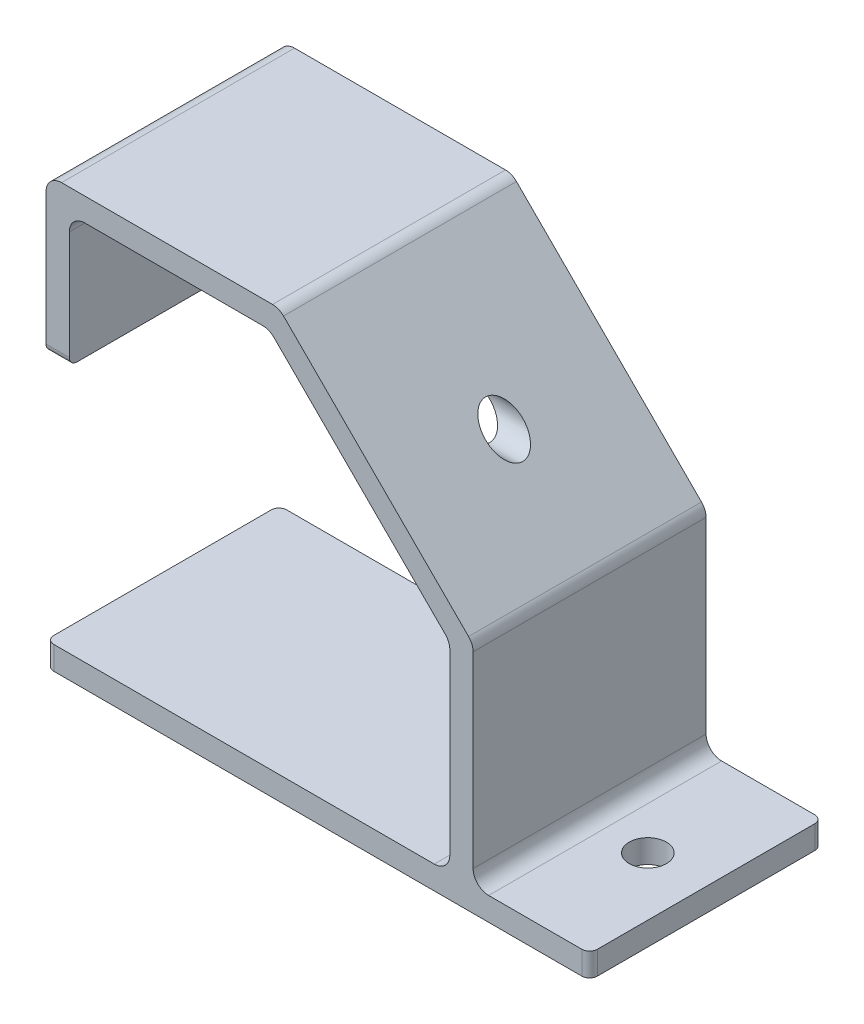
ISO-10303-21;
HEADER;
FILE_DESCRIPTION(('STEP AP214'),'2;1');
FILE_NAME('part.step','',(''),(''),'','','');
FILE_SCHEMA(('AUTOMOTIVE_DESIGN { 1 0 10303 214 1 1 1 1 }'));
ENDSEC;
DATA;
#1=APPLICATION_CONTEXT('core data for automotive mechanical design processes');
#2=APPLICATION_PROTOCOL_DEFINITION('international standard','automotive_design',2000,#1);
#3=PRODUCT_CONTEXT('',#1,'mechanical');
#4=PRODUCT('Part','Part','',(#3));
#5=PRODUCT_RELATED_PRODUCT_CATEGORY('part','',(#4));
#6=PRODUCT_DEFINITION_FORMATION('','',#4);
#7=PRODUCT_DEFINITION_CONTEXT('part definition',#1,'design');
#8=PRODUCT_DEFINITION('design','',#6,#7);
#9=PRODUCT_DEFINITION_SHAPE('','',#8);
#10=(LENGTH_UNIT() NAMED_UNIT(*) SI_UNIT(.MILLI.,.METRE.));
#11=(NAMED_UNIT(*) PLANE_ANGLE_UNIT() SI_UNIT($,.RADIAN.));
#12=(NAMED_UNIT(*) SI_UNIT($,.STERADIAN.) SOLID_ANGLE_UNIT());
#13=UNCERTAINTY_MEASURE_WITH_UNIT(LENGTH_MEASURE(1.E-05),#10,'distance_accuracy_value','');
#14=(GEOMETRIC_REPRESENTATION_CONTEXT(3) GLOBAL_UNCERTAINTY_ASSIGNED_CONTEXT((#13)) GLOBAL_UNIT_ASSIGNED_CONTEXT((#10,
#11,#12)) REPRESENTATION_CONTEXT('',''));
#15=CARTESIAN_POINT('',(0.,0.,0.));
#16=DIRECTION('',(0.,0.,1.));
#17=DIRECTION('',(1.,0.,0.));
#18=AXIS2_PLACEMENT_3D('',#15,#16,#17);
#19=CARTESIAN_POINT('',(55.,0.,30.));
#20=DIRECTION('',(0.,-1.,0.));
#21=DIRECTION('',(1.,0.,0.));
#22=AXIS2_PLACEMENT_3D('',#19,#20,#21);
#23=PLANE('',#22);
#24=CARTESIAN_POINT('',(62.5,0.,15.));
#25=DIRECTION('',(0.,1.,0.));
#26=DIRECTION('',(0.,0.,1.));
#27=AXIS2_PLACEMENT_3D('',#24,#25,#26);
#28=CIRCLE('',#27,2.4);
#29=CARTESIAN_POINT('',(62.5,0.,17.4));
#30=VERTEX_POINT('',#29);
#31=EDGE_CURVE('E1014',#30,#30,#28,.T.);
#32=ORIENTED_EDGE('',*,*,#31,.T.);
#33=EDGE_LOOP('',(#32));
#34=FACE_BOUND('',#33,.T.);
#35=DIRECTION('',(0.,0.,-1.));
#36=VECTOR('',#35,1.);
#37=CARTESIAN_POINT('',(0.,0.,30.));
#38=LINE('',#37,#36);
#39=CARTESIAN_POINT('',(0.,0.,29.));
#40=VERTEX_POINT('',#39);
#41=CARTESIAN_POINT('',(0.,0.,1.));
#42=VERTEX_POINT('',#41);
#43=EDGE_CURVE('E556',#40,#42,#38,.T.);
#44=ORIENTED_EDGE('',*,*,#43,.T.);
#45=CARTESIAN_POINT('',(1.,0.,1.));
#46=DIRECTION('',(0.,-1.,0.));
#47=DIRECTION('',(1.,0.,0.));
#48=AXIS2_PLACEMENT_3D('',#45,#46,#47);
#49=CIRCLE('',#48,1.);
#50=CARTESIAN_POINT('',(1.,0.,0.));
#51=VERTEX_POINT('',#50);
#52=EDGE_CURVE('E411',#42,#51,#49,.T.);
#53=ORIENTED_EDGE('',*,*,#52,.T.);
#54=DIRECTION('',(-1.,0.,0.));
#55=VECTOR('',#54,1.);
#56=CARTESIAN_POINT('',(55.,0.,0.));
#57=LINE('',#56,#55);
#58=CARTESIAN_POINT('',(69.,0.,0.));
#59=VERTEX_POINT('',#58);
#60=EDGE_CURVE('E538',#59,#51,#57,.T.);
#61=ORIENTED_EDGE('',*,*,#60,.F.);
#62=CARTESIAN_POINT('',(69.,0.,1.));
#63=DIRECTION('',(0.,-1.,0.));
#64=DIRECTION('',(1.,0.,0.));
#65=AXIS2_PLACEMENT_3D('',#62,#63,#64);
#66=CIRCLE('',#65,1.);
#67=CARTESIAN_POINT('',(70.,0.,1.));
#68=VERTEX_POINT('',#67);
#69=EDGE_CURVE('E358',#59,#68,#66,.T.);
#70=ORIENTED_EDGE('',*,*,#69,.T.);
#71=DIRECTION('',(0.,0.,-1.));
#72=VECTOR('',#71,1.);
#73=CARTESIAN_POINT('',(70.,0.,30.));
#74=LINE('',#73,#72);
#75=CARTESIAN_POINT('',(70.,0.,29.));
#76=VERTEX_POINT('',#75);
#77=EDGE_CURVE('E529',#76,#68,#74,.T.);
#78=ORIENTED_EDGE('',*,*,#77,.F.);
#79=CARTESIAN_POINT('',(69.,0.,29.));
#80=DIRECTION('',(0.,-1.,0.));
#81=DIRECTION('',(1.,0.,0.));
#82=AXIS2_PLACEMENT_3D('',#79,#80,#81);
#83=CIRCLE('',#82,1.);
#84=CARTESIAN_POINT('',(69.,0.,30.));
#85=VERTEX_POINT('',#84);
#86=EDGE_CURVE('E406',#76,#85,#83,.T.);
#87=ORIENTED_EDGE('',*,*,#86,.T.);
#88=DIRECTION('',(-1.,0.,0.));
#89=VECTOR('',#88,1.);
#90=CARTESIAN_POINT('',(55.,0.,30.));
#91=LINE('',#90,#89);
#92=CARTESIAN_POINT('',(1.,0.,30.));
#93=VERTEX_POINT('',#92);
#94=EDGE_CURVE('E520',#85,#93,#91,.T.);
#95=ORIENTED_EDGE('',*,*,#94,.T.);
#96=CARTESIAN_POINT('',(1.,0.,29.));
#97=DIRECTION('',(0.,-1.,0.));
#98=DIRECTION('',(1.,0.,0.));
#99=AXIS2_PLACEMENT_3D('',#96,#97,#98);
#100=CIRCLE('',#99,1.);
#101=EDGE_CURVE('E409',#93,#40,#100,.T.);
#102=ORIENTED_EDGE('',*,*,#101,.T.);
#103=EDGE_LOOP('',(#44,#53,#61,#70,#78,#87,#95,#102));
#104=FACE_BOUND('',#103,.T.);
#105=ADVANCED_FACE('F145',(#34,#104),#23,.T.);
#106=CARTESIAN_POINT('',(55.,30.,30.));
#107=DIRECTION('',(-1.,0.,0.));
#108=DIRECTION('',(0.,-1.,0.));
#109=AXIS2_PLACEMENT_3D('',#106,#107,#108);
#110=PLANE('',#109);
#111=DIRECTION('',(0.,1.,0.));
#112=VECTOR('',#111,1.);
#113=CARTESIAN_POINT('',(55.,30.,30.));
#114=LINE('',#113,#112);
#115=CARTESIAN_POINT('',(55.,5.,30.));
#116=VERTEX_POINT('',#115);
#117=CARTESIAN_POINT('',(55.,29.1715728752538,30.));
#118=VERTEX_POINT('',#117);
#119=EDGE_CURVE('E523',#116,#118,#114,.T.);
#120=ORIENTED_EDGE('',*,*,#119,.F.);
#121=DIRECTION('',(0.,0.,-1.));
#122=VECTOR('',#121,1.);
#123=CARTESIAN_POINT('',(55.,5.,30.));
#124=LINE('',#123,#122);
#125=CARTESIAN_POINT('',(55.,5.,0.));
#126=VERTEX_POINT('',#125);
#127=EDGE_CURVE('E420',#116,#126,#124,.T.);
#128=ORIENTED_EDGE('',*,*,#127,.T.);
#129=DIRECTION('',(0.,1.,0.));
#130=VECTOR('',#129,1.);
#131=CARTESIAN_POINT('',(55.,30.,0.));
#132=LINE('',#131,#130);
#133=CARTESIAN_POINT('',(55.,29.1715728752538,0.));
#134=VERTEX_POINT('',#133);
#135=EDGE_CURVE('E540',#126,#134,#132,.T.);
#136=ORIENTED_EDGE('',*,*,#135,.T.);
#137=DIRECTION('',(0.,0.,-1.));
#138=VECTOR('',#137,1.);
#139=CARTESIAN_POINT('',(55.,29.1715728752538,30.));
#140=LINE('',#139,#138);
#141=EDGE_CURVE('E354',#134,#118,#140,.F.);
#142=ORIENTED_EDGE('',*,*,#141,.T.);
#143=EDGE_LOOP('',(#120,#128,#136,#142));
#144=FACE_BOUND('',#143,.T.);
#145=ADVANCED_FACE('F624',(#144),#110,.F.);
#146=CARTESIAN_POINT('',(30.,55.,30.));
#147=DIRECTION('',(-0.707106781186548,-0.707106781186547,0.));
#148=DIRECTION('',(0.707106781186547,-0.707106781186548,0.));
#149=AXIS2_PLACEMENT_3D('',#146,#147,#148);
#150=PLANE('',#149);
#151=CARTESIAN_POINT('',(44.,41.,15.));
#152=DIRECTION('',(-0.707106781186548,-0.707106781186547,0.));
#153=DIRECTION('',(-0.707106781186547,0.707106781186548,0.));
#154=AXIS2_PLACEMENT_3D('',#151,#152,#153);
#155=ELLIPSE('',#154,3.39411254969541,2.39999999999999);
#156=CARTESIAN_POINT('',(41.6,43.4,15.));
#157=VERTEX_POINT('',#156);
#158=EDGE_CURVE('E560',#157,#157,#155,.T.);
#159=ORIENTED_EDGE('',*,*,#158,.T.);
#160=EDGE_LOOP('',(#159));
#161=FACE_BOUND('',#160,.T.);
#162=DIRECTION('',(-0.707106781186547,0.707106781186548,0.));
#163=VECTOR('',#162,1.);
#164=CARTESIAN_POINT('',(30.,55.,30.));
#165=LINE('',#164,#163);
#166=CARTESIAN_POINT('',(54.4142135623731,30.5857864376269,30.));
#167=VERTEX_POINT('',#166);
#168=CARTESIAN_POINT('',(30.5857864376269,54.4142135623731,30.));
#169=VERTEX_POINT('',#168);
#170=EDGE_CURVE('E525',#167,#169,#165,.T.);
#171=ORIENTED_EDGE('',*,*,#170,.F.);
#172=DIRECTION('',(0.,0.,-1.));
#173=VECTOR('',#172,1.);
#174=CARTESIAN_POINT('',(54.4142135623731,30.5857864376269,30.));
#175=LINE('',#174,#173);
#176=CARTESIAN_POINT('',(54.4142135623731,30.5857864376269,0.));
#177=VERTEX_POINT('',#176);
#178=EDGE_CURVE('E445',#167,#177,#175,.T.);
#179=ORIENTED_EDGE('',*,*,#178,.T.);
#180=DIRECTION('',(-0.707106781186547,0.707106781186548,0.));
#181=VECTOR('',#180,1.);
#182=CARTESIAN_POINT('',(30.,55.,0.));
#183=LINE('',#182,#181);
#184=CARTESIAN_POINT('',(30.5857864376269,54.4142135623731,0.));
#185=VERTEX_POINT('',#184);
#186=EDGE_CURVE('E543',#177,#185,#183,.T.);
#187=ORIENTED_EDGE('',*,*,#186,.T.);
#188=DIRECTION('',(0.,0.,-1.));
#189=VECTOR('',#188,1.);
#190=CARTESIAN_POINT('',(30.5857864376269,54.4142135623731,30.));
#191=LINE('',#190,#189);
#192=EDGE_CURVE('E160',#185,#169,#191,.F.);
#193=ORIENTED_EDGE('',*,*,#192,.T.);
#194=EDGE_LOOP('',(#171,#179,#187,#193));
#195=FACE_BOUND('',#194,.T.);
#196=ADVANCED_FACE('F626',(#161,#195),#150,.F.);
#197=CARTESIAN_POINT('',(0.,55.,30.));
#198=DIRECTION('',(0.,-1.,0.));
#199=DIRECTION('',(1.,0.,0.));
#200=AXIS2_PLACEMENT_3D('',#197,#198,#199);
#201=PLANE('',#200);
#202=DIRECTION('',(-1.,0.,0.));
#203=VECTOR('',#202,1.);
#204=CARTESIAN_POINT('',(0.,55.,0.));
#205=LINE('',#204,#203);
#206=CARTESIAN_POINT('',(29.1715728752538,55.,0.));
#207=VERTEX_POINT('',#206);
#208=CARTESIAN_POINT('',(2.,55.,0.));
#209=VERTEX_POINT('',#208);
#210=EDGE_CURVE('E545',#207,#209,#205,.T.);
#211=ORIENTED_EDGE('',*,*,#210,.T.);
#212=DIRECTION('',(0.,0.,-1.));
#213=VECTOR('',#212,1.);
#214=CARTESIAN_POINT('',(2.,55.,30.));
#215=LINE('',#214,#213);
#216=CARTESIAN_POINT('',(2.,55.,30.));
#217=VERTEX_POINT('',#216);
#218=EDGE_CURVE('E437',#209,#217,#215,.F.);
#219=ORIENTED_EDGE('',*,*,#218,.T.);
#220=DIRECTION('',(-1.,0.,0.));
#221=VECTOR('',#220,1.);
#222=CARTESIAN_POINT('',(0.,55.,30.));
#223=LINE('',#222,#221);
#224=CARTESIAN_POINT('',(29.1715728752538,55.,30.));
#225=VERTEX_POINT('',#224);
#226=EDGE_CURVE('E527',#225,#217,#223,.T.);
#227=ORIENTED_EDGE('',*,*,#226,.F.);
#228=DIRECTION('',(0.,0.,-1.));
#229=VECTOR('',#228,1.);
#230=CARTESIAN_POINT('',(29.1715728752538,55.,30.));
#231=LINE('',#230,#229);
#232=EDGE_CURVE('E434',#225,#207,#231,.T.);
#233=ORIENTED_EDGE('',*,*,#232,.T.);
#234=EDGE_LOOP('',(#211,#219,#227,#233));
#235=FACE_BOUND('',#234,.T.);
#236=ADVANCED_FACE('F633',(#235),#201,.F.);
#237=CARTESIAN_POINT('',(0.,55.,30.));
#238=DIRECTION('',(1.,0.,0.));
#239=DIRECTION('',(0.,1.,0.));
#240=AXIS2_PLACEMENT_3D('',#237,#238,#239);
#241=PLANE('',#240);
#242=CARTESIAN_POINT('',(0.,41.,15.));
#243=DIRECTION('',(-1.,0.,0.));
#244=DIRECTION('',(0.,0.,1.));
#245=AXIS2_PLACEMENT_3D('',#242,#243,#244);
#246=CIRCLE('',#245,2.39999999999999);
#247=CARTESIAN_POINT('',(0.,41.,17.4));
#248=VERTEX_POINT('',#247);
#249=EDGE_CURVE('E666',#248,#248,#246,.T.);
#250=ORIENTED_EDGE('',*,*,#249,.F.);
#251=EDGE_LOOP('',(#250));
#252=FACE_BOUND('',#251,.T.);
#253=DIRECTION('',(0.,-1.,0.));
#254=VECTOR('',#253,1.);
#255=CARTESIAN_POINT('',(0.,55.,30.));
#256=LINE('',#255,#254);
#257=CARTESIAN_POINT('',(0.,53.,30.));
#258=VERTEX_POINT('',#257);
#259=CARTESIAN_POINT('',(0.,36.,30.));
#260=VERTEX_POINT('',#259);
#261=EDGE_CURVE('E514',#258,#260,#256,.T.);
#262=ORIENTED_EDGE('',*,*,#261,.F.);
#263=DIRECTION('',(0.,0.,-1.));
#264=VECTOR('',#263,1.);
#265=CARTESIAN_POINT('',(0.,53.,30.));
#266=LINE('',#265,#264);
#267=CARTESIAN_POINT('',(0.,53.,0.));
#268=VERTEX_POINT('',#267);
#269=EDGE_CURVE('E425',#258,#268,#266,.T.);
#270=ORIENTED_EDGE('',*,*,#269,.T.);
#271=DIRECTION('',(0.,-1.,0.));
#272=VECTOR('',#271,1.);
#273=CARTESIAN_POINT('',(0.,55.,0.));
#274=LINE('',#273,#272);
#275=CARTESIAN_POINT('',(0.,36.,0.));
#276=VERTEX_POINT('',#275);
#277=EDGE_CURVE('E496',#268,#276,#274,.T.);
#278=ORIENTED_EDGE('',*,*,#277,.T.);
#279=CARTESIAN_POINT('',(0.,36.,1.));
#280=DIRECTION('',(1.,0.,0.));
#281=DIRECTION('',(0.,1.,0.));
#282=AXIS2_PLACEMENT_3D('',#279,#280,#281);
#283=CIRCLE('',#282,1.);
#284=CARTESIAN_POINT('',(0.,35.,1.));
#285=VERTEX_POINT('',#284);
#286=EDGE_CURVE('E377',#276,#285,#283,.F.);
#287=ORIENTED_EDGE('',*,*,#286,.T.);
#288=DIRECTION('',(0.,0.,-1.));
#289=VECTOR('',#288,1.);
#290=CARTESIAN_POINT('',(0.,35.,30.));
#291=LINE('',#290,#289);
#292=CARTESIAN_POINT('',(0.,35.,29.));
#293=VERTEX_POINT('',#292);
#294=EDGE_CURVE('E360',#293,#285,#291,.T.);
#295=ORIENTED_EDGE('',*,*,#294,.F.);
#296=CARTESIAN_POINT('',(0.,36.,29.));
#297=DIRECTION('',(1.,0.,0.));
#298=DIRECTION('',(0.,1.,0.));
#299=AXIS2_PLACEMENT_3D('',#296,#297,#298);
#300=CIRCLE('',#299,1.);
#301=EDGE_CURVE('E374',#293,#260,#300,.F.);
#302=ORIENTED_EDGE('',*,*,#301,.T.);
#303=EDGE_LOOP('',(#262,#270,#278,#287,#295,#302));
#304=FACE_BOUND('',#303,.T.);
#305=ADVANCED_FACE('F655',(#252,#304),#241,.F.);
#306=CARTESIAN_POINT('',(3.,35.,30.));
#307=DIRECTION('',(0.,-1.,0.));
#308=DIRECTION('',(0.,0.,-1.));
#309=AXIS2_PLACEMENT_3D('',#306,#307,#308);
#310=PLANE('',#309);
#311=ORIENTED_EDGE('',*,*,#294,.T.);
#312=DIRECTION('',(-1.,0.,0.));
#313=VECTOR('',#312,1.);
#314=CARTESIAN_POINT('',(3.,35.,1.));
#315=LINE('',#314,#313);
#316=CARTESIAN_POINT('',(3.,35.,1.));
#317=VERTEX_POINT('',#316);
#318=EDGE_CURVE('E382',#285,#317,#315,.F.);
#319=ORIENTED_EDGE('',*,*,#318,.T.);
#320=DIRECTION('',(0.,0.,-1.));
#321=VECTOR('',#320,1.);
#322=CARTESIAN_POINT('',(3.,35.,30.));
#323=LINE('',#322,#321);
#324=CARTESIAN_POINT('',(3.,35.,29.));
#325=VERTEX_POINT('',#324);
#326=EDGE_CURVE('E366',#325,#317,#323,.T.);
#327=ORIENTED_EDGE('',*,*,#326,.F.);
#328=DIRECTION('',(-1.,0.,0.));
#329=VECTOR('',#328,1.);
#330=CARTESIAN_POINT('',(0.,35.,29.));
#331=LINE('',#330,#329);
#332=EDGE_CURVE('E379',#325,#293,#331,.T.);
#333=ORIENTED_EDGE('',*,*,#332,.T.);
#334=EDGE_LOOP('',(#311,#319,#327,#333));
#335=FACE_BOUND('',#334,.T.);
#336=ADVANCED_FACE('F651',(#335),#310,.T.);
#337=CARTESIAN_POINT('',(3.,55.,30.));
#338=DIRECTION('',(1.,0.,0.));
#339=DIRECTION('',(0.,1.,0.));
#340=AXIS2_PLACEMENT_3D('',#337,#338,#339);
#341=PLANE('',#340);
#342=CARTESIAN_POINT('',(3.,41.,15.));
#343=DIRECTION('',(1.,0.,0.));
#344=DIRECTION('',(0.,1.,0.));
#345=AXIS2_PLACEMENT_3D('',#342,#343,#344);
#346=CIRCLE('',#345,2.39999999999999);
#347=CARTESIAN_POINT('',(3.,43.4,15.));
#348=VERTEX_POINT('',#347);
#349=EDGE_CURVE('E1008',#348,#348,#346,.T.);
#350=ORIENTED_EDGE('',*,*,#349,.F.);
#351=EDGE_LOOP('',(#350));
#352=FACE_BOUND('',#351,.T.);
#353=DIRECTION('',(0.,-1.,0.));
#354=VECTOR('',#353,1.);
#355=CARTESIAN_POINT('',(3.,55.,0.));
#356=LINE('',#355,#354);
#357=CARTESIAN_POINT('',(3.,50.,0.));
#358=VERTEX_POINT('',#357);
#359=CARTESIAN_POINT('',(3.,36.,0.));
#360=VERTEX_POINT('',#359);
#361=EDGE_CURVE('E484',#358,#360,#356,.T.);
#362=ORIENTED_EDGE('',*,*,#361,.F.);
#363=DIRECTION('',(0.,0.,-1.));
#364=VECTOR('',#363,1.);
#365=CARTESIAN_POINT('',(3.,50.,30.));
#366=LINE('',#365,#364);
#367=CARTESIAN_POINT('',(3.,50.,30.));
#368=VERTEX_POINT('',#367);
#369=EDGE_CURVE('E466',#358,#368,#366,.F.);
#370=ORIENTED_EDGE('',*,*,#369,.T.);
#371=DIRECTION('',(0.,-1.,0.));
#372=VECTOR('',#371,1.);
#373=CARTESIAN_POINT('',(3.,55.,30.));
#374=LINE('',#373,#372);
#375=CARTESIAN_POINT('',(3.,36.,30.));
#376=VERTEX_POINT('',#375);
#377=EDGE_CURVE('E505',#368,#376,#374,.T.);
#378=ORIENTED_EDGE('',*,*,#377,.T.);
#379=CARTESIAN_POINT('',(3.,36.,29.));
#380=DIRECTION('',(1.,0.,0.));
#381=DIRECTION('',(0.,1.,0.));
#382=AXIS2_PLACEMENT_3D('',#379,#380,#381);
#383=CIRCLE('',#382,1.);
#384=EDGE_CURVE('E384',#376,#325,#383,.T.);
#385=ORIENTED_EDGE('',*,*,#384,.T.);
#386=ORIENTED_EDGE('',*,*,#326,.T.);
#387=CARTESIAN_POINT('',(3.,36.,1.));
#388=DIRECTION('',(1.,0.,0.));
#389=DIRECTION('',(0.,1.,0.));
#390=AXIS2_PLACEMENT_3D('',#387,#388,#389);
#391=CIRCLE('',#390,1.);
#392=EDGE_CURVE('E386',#317,#360,#391,.T.);
#393=ORIENTED_EDGE('',*,*,#392,.T.);
#394=EDGE_LOOP('',(#362,#370,#378,#385,#386,#393));
#395=FACE_BOUND('',#394,.T.);
#396=ADVANCED_FACE('F491',(#352,#395),#341,.T.);
#397=CARTESIAN_POINT('',(0.,52.,30.));
#398=DIRECTION('',(0.,-1.,0.));
#399=DIRECTION('',(1.,0.,0.));
#400=AXIS2_PLACEMENT_3D('',#397,#398,#399);
#401=PLANE('',#400);
#402=DIRECTION('',(-1.,0.,0.));
#403=VECTOR('',#402,1.);
#404=CARTESIAN_POINT('',(0.,52.,0.));
#405=LINE('',#404,#403);
#406=CARTESIAN_POINT('',(27.9289321881345,52.,0.));
#407=VERTEX_POINT('',#406);
#408=CARTESIAN_POINT('',(5.,52.,0.));
#409=VERTEX_POINT('',#408);
#410=EDGE_CURVE('E486',#407,#409,#405,.T.);
#411=ORIENTED_EDGE('',*,*,#410,.F.);
#412=DIRECTION('',(0.,0.,-1.));
#413=VECTOR('',#412,1.);
#414=CARTESIAN_POINT('',(27.9289321881345,52.,30.));
#415=LINE('',#414,#413);
#416=CARTESIAN_POINT('',(27.9289321881345,52.,30.));
#417=VERTEX_POINT('',#416);
#418=EDGE_CURVE('E464',#407,#417,#415,.F.);
#419=ORIENTED_EDGE('',*,*,#418,.T.);
#420=DIRECTION('',(-1.,0.,0.));
#421=VECTOR('',#420,1.);
#422=CARTESIAN_POINT('',(0.,52.,30.));
#423=LINE('',#422,#421);
#424=CARTESIAN_POINT('',(5.,52.,30.));
#425=VERTEX_POINT('',#424);
#426=EDGE_CURVE('E503',#417,#425,#423,.T.);
#427=ORIENTED_EDGE('',*,*,#426,.T.);
#428=DIRECTION('',(0.,0.,-1.));
#429=VECTOR('',#428,1.);
#430=CARTESIAN_POINT('',(5.,52.,0.));
#431=LINE('',#430,#429);
#432=EDGE_CURVE('E461',#425,#409,#431,.T.);
#433=ORIENTED_EDGE('',*,*,#432,.T.);
#434=EDGE_LOOP('',(#411,#419,#427,#433));
#435=FACE_BOUND('',#434,.T.);
#436=ADVANCED_FACE('F507',(#435),#401,.T.);
#437=CARTESIAN_POINT('',(27.8786796564404,52.8786796564404,30.));
#438=DIRECTION('',(-0.707106781186548,-0.707106781186547,0.));
#439=DIRECTION('',(0.707106781186547,-0.707106781186548,0.));
#440=AXIS2_PLACEMENT_3D('',#437,#438,#439);
#441=PLANE('',#440);
#442=CARTESIAN_POINT('',(39.7573593128807,41.,15.));
#443=DIRECTION('',(-0.707106781186548,-0.707106781186547,0.));
#444=DIRECTION('',(-0.707106781186547,0.707106781186548,0.));
#445=AXIS2_PLACEMENT_3D('',#442,#443,#444);
#446=ELLIPSE('',#445,3.39411254969541,2.39999999999999);
#447=CARTESIAN_POINT('',(37.3573593128807,43.4,15.));
#448=VERTEX_POINT('',#447);
#449=EDGE_CURVE('E369',#448,#448,#446,.T.);
#450=ORIENTED_EDGE('',*,*,#449,.F.);
#451=EDGE_LOOP('',(#450));
#452=FACE_BOUND('',#451,.T.);
#453=DIRECTION('',(-0.707106781186547,0.707106781186548,0.));
#454=VECTOR('',#453,1.);
#455=CARTESIAN_POINT('',(27.8786796564404,52.8786796564404,0.));
#456=LINE('',#455,#454);
#457=CARTESIAN_POINT('',(51.4142135623731,29.3431457505076,0.));
#458=VERTEX_POINT('',#457);
#459=CARTESIAN_POINT('',(29.3431457505076,51.4142135623731,0.));
#460=VERTEX_POINT('',#459);
#461=EDGE_CURVE('E532',#458,#460,#456,.T.);
#462=ORIENTED_EDGE('',*,*,#461,.F.);
#463=DIRECTION('',(0.,0.,-1.));
#464=VECTOR('',#463,1.);
#465=CARTESIAN_POINT('',(51.4142135623731,29.3431457505076,30.));
#466=LINE('',#465,#464);
#467=CARTESIAN_POINT('',(51.4142135623731,29.3431457505076,30.));
#468=VERTEX_POINT('',#467);
#469=EDGE_CURVE('E459',#458,#468,#466,.F.);
#470=ORIENTED_EDGE('',*,*,#469,.T.);
#471=DIRECTION('',(-0.707106781186547,0.707106781186548,0.));
#472=VECTOR('',#471,1.);
#473=CARTESIAN_POINT('',(27.8786796564404,52.8786796564404,30.));
#474=LINE('',#473,#472);
#475=CARTESIAN_POINT('',(29.3431457505076,51.4142135623731,30.));
#476=VERTEX_POINT('',#475);
#477=EDGE_CURVE('E509',#468,#476,#474,.T.);
#478=ORIENTED_EDGE('',*,*,#477,.T.);
#479=DIRECTION('',(0.,0.,-1.));
#480=VECTOR('',#479,1.);
#481=CARTESIAN_POINT('',(29.3431457505076,51.4142135623731,0.));
#482=LINE('',#481,#480);
#483=EDGE_CURVE('E456',#476,#460,#482,.T.);
#484=ORIENTED_EDGE('',*,*,#483,.T.);
#485=EDGE_LOOP('',(#462,#470,#478,#484));
#486=FACE_BOUND('',#485,.T.);
#487=ADVANCED_FACE('F594',(#452,#486),#441,.T.);
#488=CARTESIAN_POINT('',(52.,30.,30.));
#489=DIRECTION('',(-1.,0.,0.));
#490=DIRECTION('',(0.,-1.,0.));
#491=AXIS2_PLACEMENT_3D('',#488,#489,#490);
#492=PLANE('',#491);
#493=DIRECTION('',(0.,1.,0.));
#494=VECTOR('',#493,1.);
#495=CARTESIAN_POINT('',(52.,30.,0.));
#496=LINE('',#495,#494);
#497=CARTESIAN_POINT('',(52.,5.,0.));
#498=VERTEX_POINT('',#497);
#499=CARTESIAN_POINT('',(52.,27.9289321881345,0.));
#500=VERTEX_POINT('',#499);
#501=EDGE_CURVE('E535',#498,#500,#496,.T.);
#502=ORIENTED_EDGE('',*,*,#501,.F.);
#503=DIRECTION('',(0.,0.,-1.));
#504=VECTOR('',#503,1.);
#505=CARTESIAN_POINT('',(52.,5.,30.));
#506=LINE('',#505,#504);
#507=CARTESIAN_POINT('',(52.,5.,30.));
#508=VERTEX_POINT('',#507);
#509=EDGE_CURVE('E454',#498,#508,#506,.F.);
#510=ORIENTED_EDGE('',*,*,#509,.T.);
#511=DIRECTION('',(0.,1.,0.));
#512=VECTOR('',#511,1.);
#513=CARTESIAN_POINT('',(52.,30.,30.));
#514=LINE('',#513,#512);
#515=CARTESIAN_POINT('',(52.,27.9289321881345,30.));
#516=VERTEX_POINT('',#515);
#517=EDGE_CURVE('E512',#508,#516,#514,.T.);
#518=ORIENTED_EDGE('',*,*,#517,.T.);
#519=DIRECTION('',(0.,0.,-1.));
#520=VECTOR('',#519,1.);
#521=CARTESIAN_POINT('',(52.,27.9289321881345,0.));
#522=LINE('',#521,#520);
#523=EDGE_CURVE('E451',#516,#500,#522,.T.);
#524=ORIENTED_EDGE('',*,*,#523,.T.);
#525=EDGE_LOOP('',(#502,#510,#518,#524));
#526=FACE_BOUND('',#525,.T.);
#527=ADVANCED_FACE('F585',(#526),#492,.T.);
#528=CARTESIAN_POINT('',(0.,0.,0.));
#529=DIRECTION('',(0.,0.,-1.));
#530=DIRECTION('',(-1.,0.,0.));
#531=AXIS2_PLACEMENT_3D('',#528,#529,#530);
#532=PLANE('',#531);
#533=ORIENTED_EDGE('',*,*,#277,.F.);
#534=CARTESIAN_POINT('',(2.,53.,0.));
#535=DIRECTION('',(0.,0.,-1.));
#536=DIRECTION('',(-1.,0.,0.));
#537=AXIS2_PLACEMENT_3D('',#534,#535,#536);
#538=CIRCLE('',#537,2.);
#539=EDGE_CURVE('E432',#268,#209,#538,.T.);
#540=ORIENTED_EDGE('',*,*,#539,.T.);
#541=ORIENTED_EDGE('',*,*,#210,.F.);
#542=CARTESIAN_POINT('',(29.1715728752538,53.,0.));
#543=DIRECTION('',(0.,0.,-1.));
#544=DIRECTION('',(-1.,0.,0.));
#545=AXIS2_PLACEMENT_3D('',#542,#543,#544);
#546=CIRCLE('',#545,2.);
#547=EDGE_CURVE('E428',#207,#185,#546,.T.);
#548=ORIENTED_EDGE('',*,*,#547,.T.);
#549=ORIENTED_EDGE('',*,*,#186,.F.);
#550=CARTESIAN_POINT('',(53.,29.1715728752538,0.));
#551=DIRECTION('',(0.,0.,-1.));
#552=DIRECTION('',(-1.,0.,0.));
#553=AXIS2_PLACEMENT_3D('',#550,#551,#552);
#554=CIRCLE('',#553,2.);
#555=EDGE_CURVE('E430',#177,#134,#554,.T.);
#556=ORIENTED_EDGE('',*,*,#555,.T.);
#557=ORIENTED_EDGE('',*,*,#135,.F.);
#558=CARTESIAN_POINT('',(57.,5.,0.));
#559=DIRECTION('',(0.,0.,-1.));
#560=DIRECTION('',(-1.,0.,0.));
#561=AXIS2_PLACEMENT_3D('',#558,#559,#560);
#562=CIRCLE('',#561,2.);
#563=CARTESIAN_POINT('',(57.,3.,0.));
#564=VERTEX_POINT('',#563);
#565=EDGE_CURVE('E340',#126,#564,#562,.F.);
#566=ORIENTED_EDGE('',*,*,#565,.T.);
#567=DIRECTION('',(1.,0.,0.));
#568=VECTOR('',#567,1.);
#569=CARTESIAN_POINT('',(55.,3.,0.));
#570=LINE('',#569,#568);
#571=CARTESIAN_POINT('',(69.,3.,0.));
#572=VERTEX_POINT('',#571);
#573=EDGE_CURVE('E331',#564,#572,#570,.T.);
#574=ORIENTED_EDGE('',*,*,#573,.T.);
#575=DIRECTION('',(0.,-1.,0.));
#576=VECTOR('',#575,1.);
#577=CARTESIAN_POINT('',(69.,0.,0.));
#578=LINE('',#577,#576);
#579=EDGE_CURVE('E337',#572,#59,#578,.T.);
#580=ORIENTED_EDGE('',*,*,#579,.T.);
#581=ORIENTED_EDGE('',*,*,#60,.T.);
#582=DIRECTION('',(0.,1.,0.));
#583=VECTOR('',#582,1.);
#584=CARTESIAN_POINT('',(1.,0.,0.));
#585=LINE('',#584,#583);
#586=CARTESIAN_POINT('',(1.,3.,0.));
#587=VERTEX_POINT('',#586);
#588=EDGE_CURVE('E359',#51,#587,#585,.T.);
#589=ORIENTED_EDGE('',*,*,#588,.T.);
#590=DIRECTION('',(1.,0.,0.));
#591=VECTOR('',#590,1.);
#592=CARTESIAN_POINT('',(55.,3.,0.));
#593=LINE('',#592,#591);
#594=CARTESIAN_POINT('',(50.,3.,0.));
#595=VERTEX_POINT('',#594);
#596=EDGE_CURVE('E557',#587,#595,#593,.T.);
#597=ORIENTED_EDGE('',*,*,#596,.T.);
#598=CARTESIAN_POINT('',(50.,5.,0.));
#599=DIRECTION('',(0.,0.,-1.));
#600=DIRECTION('',(-1.,0.,0.));
#601=AXIS2_PLACEMENT_3D('',#598,#599,#600);
#602=CIRCLE('',#601,2.);
#603=EDGE_CURVE('E471',#595,#498,#602,.F.);
#604=ORIENTED_EDGE('',*,*,#603,.T.);
#605=ORIENTED_EDGE('',*,*,#501,.T.);
#606=CARTESIAN_POINT('',(50.,27.9289321881345,0.));
#607=DIRECTION('',(0.,0.,-1.));
#608=DIRECTION('',(-1.,0.,0.));
#609=AXIS2_PLACEMENT_3D('',#606,#607,#608);
#610=CIRCLE('',#609,2.);
#611=EDGE_CURVE('E475',#500,#458,#610,.F.);
#612=ORIENTED_EDGE('',*,*,#611,.T.);
#613=ORIENTED_EDGE('',*,*,#461,.T.);
#614=CARTESIAN_POINT('',(27.9289321881345,50.,0.));
#615=DIRECTION('',(0.,0.,-1.));
#616=DIRECTION('',(-1.,0.,0.));
#617=AXIS2_PLACEMENT_3D('',#614,#615,#616);
#618=CIRCLE('',#617,2.);
#619=EDGE_CURVE('E479',#460,#407,#618,.F.);
#620=ORIENTED_EDGE('',*,*,#619,.T.);
#621=ORIENTED_EDGE('',*,*,#410,.T.);
#622=CARTESIAN_POINT('',(5.,50.,0.));
#623=DIRECTION('',(0.,0.,-1.));
#624=DIRECTION('',(-1.,0.,0.));
#625=AXIS2_PLACEMENT_3D('',#622,#623,#624);
#626=CIRCLE('',#625,2.);
#627=EDGE_CURVE('E153',#409,#358,#626,.F.);
#628=ORIENTED_EDGE('',*,*,#627,.T.);
#629=ORIENTED_EDGE('',*,*,#361,.T.);
#630=DIRECTION('',(-1.,0.,0.));
#631=VECTOR('',#630,1.);
#632=CARTESIAN_POINT('',(0.,36.,0.));
#633=LINE('',#632,#631);
#634=EDGE_CURVE('E363',#360,#276,#633,.T.);
#635=ORIENTED_EDGE('',*,*,#634,.T.);
#636=EDGE_LOOP('',(#533,#540,#541,#548,#549,#556,#557,#566,#574,#580,#581,#589,#597,#604,#605,
#612,#613,#620,#621,#628,#629,#635));
#637=FACE_BOUND('',#636,.T.);
#638=ADVANCED_FACE('F334',(#637),#532,.T.);
#639=CARTESIAN_POINT('',(0.,0.,30.));
#640=DIRECTION('',(0.,0.,-1.));
#641=DIRECTION('',(-1.,0.,0.));
#642=AXIS2_PLACEMENT_3D('',#639,#640,#641);
#643=PLANE('',#642);
#644=ORIENTED_EDGE('',*,*,#226,.T.);
#645=CARTESIAN_POINT('',(2.,53.,30.));
#646=DIRECTION('',(0.,0.,-1.));
#647=DIRECTION('',(-1.,0.,0.));
#648=AXIS2_PLACEMENT_3D('',#645,#646,#647);
#649=CIRCLE('',#648,2.);
#650=EDGE_CURVE('E442',#217,#258,#649,.F.);
#651=ORIENTED_EDGE('',*,*,#650,.T.);
#652=ORIENTED_EDGE('',*,*,#261,.T.);
#653=DIRECTION('',(-1.,0.,0.));
#654=VECTOR('',#653,1.);
#655=CARTESIAN_POINT('',(3.,36.,30.));
#656=LINE('',#655,#654);
#657=EDGE_CURVE('E394',#260,#376,#656,.F.);
#658=ORIENTED_EDGE('',*,*,#657,.T.);
#659=ORIENTED_EDGE('',*,*,#377,.F.);
#660=CARTESIAN_POINT('',(5.,50.,30.));
#661=DIRECTION('',(0.,0.,-1.));
#662=DIRECTION('',(-1.,0.,0.));
#663=AXIS2_PLACEMENT_3D('',#660,#661,#662);
#664=CIRCLE('',#663,2.);
#665=EDGE_CURVE('E12',#368,#425,#664,.T.);
#666=ORIENTED_EDGE('',*,*,#665,.T.);
#667=ORIENTED_EDGE('',*,*,#426,.F.);
#668=CARTESIAN_POINT('',(27.9289321881345,50.,30.));
#669=DIRECTION('',(0.,0.,-1.));
#670=DIRECTION('',(-1.,0.,0.));
#671=AXIS2_PLACEMENT_3D('',#668,#669,#670);
#672=CIRCLE('',#671,2.);
#673=EDGE_CURVE('E481',#417,#476,#672,.T.);
#674=ORIENTED_EDGE('',*,*,#673,.T.);
#675=ORIENTED_EDGE('',*,*,#477,.F.);
#676=CARTESIAN_POINT('',(50.,27.9289321881345,30.));
#677=DIRECTION('',(0.,0.,-1.));
#678=DIRECTION('',(-1.,0.,0.));
#679=AXIS2_PLACEMENT_3D('',#676,#677,#678);
#680=CIRCLE('',#679,2.);
#681=EDGE_CURVE('E477',#468,#516,#680,.T.);
#682=ORIENTED_EDGE('',*,*,#681,.T.);
#683=ORIENTED_EDGE('',*,*,#517,.F.);
#684=CARTESIAN_POINT('',(50.,5.,30.));
#685=DIRECTION('',(0.,0.,-1.));
#686=DIRECTION('',(-1.,0.,0.));
#687=AXIS2_PLACEMENT_3D('',#684,#685,#686);
#688=CIRCLE('',#687,2.);
#689=CARTESIAN_POINT('',(50.,3.,30.));
#690=VERTEX_POINT('',#689);
#691=EDGE_CURVE('E473',#508,#690,#688,.T.);
#692=ORIENTED_EDGE('',*,*,#691,.T.);
#693=DIRECTION('',(1.,0.,0.));
#694=VECTOR('',#693,1.);
#695=CARTESIAN_POINT('',(55.,3.,30.));
#696=LINE('',#695,#694);
#697=CARTESIAN_POINT('',(1.,3.,30.));
#698=VERTEX_POINT('',#697);
#699=EDGE_CURVE('E553',#698,#690,#696,.T.);
#700=ORIENTED_EDGE('',*,*,#699,.F.);
#701=DIRECTION('',(0.,1.,0.));
#702=VECTOR('',#701,1.);
#703=CARTESIAN_POINT('',(1.,0.,30.));
#704=LINE('',#703,#702);
#705=EDGE_CURVE('E392',#698,#93,#704,.F.);
#706=ORIENTED_EDGE('',*,*,#705,.T.);
#707=ORIENTED_EDGE('',*,*,#94,.F.);
#708=DIRECTION('',(0.,-1.,0.));
#709=VECTOR('',#708,1.);
#710=CARTESIAN_POINT('',(69.,3.,30.));
#711=LINE('',#710,#709);
#712=CARTESIAN_POINT('',(69.,3.,30.));
#713=VERTEX_POINT('',#712);
#714=EDGE_CURVE('E389',#85,#713,#711,.F.);
#715=ORIENTED_EDGE('',*,*,#714,.T.);
#716=DIRECTION('',(1.,0.,0.));
#717=VECTOR('',#716,1.);
#718=CARTESIAN_POINT('',(55.,3.,30.));
#719=LINE('',#718,#717);
#720=CARTESIAN_POINT('',(57.,3.,30.));
#721=VERTEX_POINT('',#720);
#722=EDGE_CURVE('E343',#721,#713,#719,.T.);
#723=ORIENTED_EDGE('',*,*,#722,.F.);
#724=CARTESIAN_POINT('',(57.,5.,30.));
#725=DIRECTION('',(0.,0.,-1.));
#726=DIRECTION('',(-1.,0.,0.));
#727=AXIS2_PLACEMENT_3D('',#724,#725,#726);
#728=CIRCLE('',#727,2.);
#729=EDGE_CURVE('E469',#721,#116,#728,.T.);
#730=ORIENTED_EDGE('',*,*,#729,.T.);
#731=ORIENTED_EDGE('',*,*,#119,.T.);
#732=CARTESIAN_POINT('',(53.,29.1715728752538,30.));
#733=DIRECTION('',(0.,0.,-1.));
#734=DIRECTION('',(-1.,0.,0.));
#735=AXIS2_PLACEMENT_3D('',#732,#733,#734);
#736=CIRCLE('',#735,2.);
#737=EDGE_CURVE('E167',#118,#167,#736,.F.);
#738=ORIENTED_EDGE('',*,*,#737,.T.);
#739=ORIENTED_EDGE('',*,*,#170,.T.);
#740=CARTESIAN_POINT('',(29.1715728752538,53.,30.));
#741=DIRECTION('',(0.,0.,-1.));
#742=DIRECTION('',(-1.,0.,0.));
#743=AXIS2_PLACEMENT_3D('',#740,#741,#742);
#744=CIRCLE('',#743,2.);
#745=EDGE_CURVE('E439',#169,#225,#744,.F.);
#746=ORIENTED_EDGE('',*,*,#745,.T.);
#747=EDGE_LOOP('',(#644,#651,#652,#658,#659,#666,#667,#674,#675,#682,#683,#692,#700,#706,#707,
#715,#723,#730,#731,#738,#739,#746));
#748=FACE_BOUND('',#747,.T.);
#749=ADVANCED_FACE('F502',(#748),#643,.F.);
#750=CARTESIAN_POINT('',(55.,3.,30.));
#751=DIRECTION('',(0.,1.,0.));
#752=DIRECTION('',(-1.,0.,0.));
#753=AXIS2_PLACEMENT_3D('',#750,#751,#752);
#754=PLANE('',#753);
#755=ORIENTED_EDGE('',*,*,#699,.T.);
#756=DIRECTION('',(0.,0.,-1.));
#757=VECTOR('',#756,1.);
#758=CARTESIAN_POINT('',(50.,3.,0.));
#759=LINE('',#758,#757);
#760=EDGE_CURVE('E448',#690,#595,#759,.T.);
#761=ORIENTED_EDGE('',*,*,#760,.T.);
#762=ORIENTED_EDGE('',*,*,#596,.F.);
#763=CARTESIAN_POINT('',(1.,3.,1.));
#764=DIRECTION('',(0.,1.,0.));
#765=DIRECTION('',(-1.,0.,0.));
#766=AXIS2_PLACEMENT_3D('',#763,#764,#765);
#767=CIRCLE('',#766,1.);
#768=CARTESIAN_POINT('',(0.,3.,1.));
#769=VERTEX_POINT('',#768);
#770=EDGE_CURVE('E399',#587,#769,#767,.T.);
#771=ORIENTED_EDGE('',*,*,#770,.T.);
#772=DIRECTION('',(0.,0.,-1.));
#773=VECTOR('',#772,1.);
#774=CARTESIAN_POINT('',(0.,3.,30.));
#775=LINE('',#774,#773);
#776=CARTESIAN_POINT('',(0.,3.,29.));
#777=VERTEX_POINT('',#776);
#778=EDGE_CURVE('E344',#777,#769,#775,.T.);
#779=ORIENTED_EDGE('',*,*,#778,.F.);
#780=CARTESIAN_POINT('',(1.,3.,29.));
#781=DIRECTION('',(0.,1.,0.));
#782=DIRECTION('',(-1.,0.,0.));
#783=AXIS2_PLACEMENT_3D('',#780,#781,#782);
#784=CIRCLE('',#783,1.);
#785=EDGE_CURVE('E397',#777,#698,#784,.T.);
#786=ORIENTED_EDGE('',*,*,#785,.T.);
#787=EDGE_LOOP('',(#755,#761,#762,#771,#779,#786));
#788=FACE_BOUND('',#787,.T.);
#789=ADVANCED_FACE('F576',(#788),#754,.T.);
#790=CARTESIAN_POINT('',(0.,0.,30.));
#791=DIRECTION('',(-1.,0.,0.));
#792=DIRECTION('',(0.,0.,1.));
#793=AXIS2_PLACEMENT_3D('',#790,#791,#792);
#794=PLANE('',#793);
#795=ORIENTED_EDGE('',*,*,#778,.T.);
#796=DIRECTION('',(0.,1.,0.));
#797=VECTOR('',#796,1.);
#798=CARTESIAN_POINT('',(0.,0.,1.));
#799=LINE('',#798,#797);
#800=EDGE_CURVE('E404',#769,#42,#799,.F.);
#801=ORIENTED_EDGE('',*,*,#800,.T.);
#802=ORIENTED_EDGE('',*,*,#43,.F.);
#803=DIRECTION('',(0.,1.,0.));
#804=VECTOR('',#803,1.);
#805=CARTESIAN_POINT('',(0.,3.,29.));
#806=LINE('',#805,#804);
#807=EDGE_CURVE('E401',#40,#777,#806,.T.);
#808=ORIENTED_EDGE('',*,*,#807,.T.);
#809=EDGE_LOOP('',(#795,#801,#802,#808));
#810=FACE_BOUND('',#809,.T.);
#811=ADVANCED_FACE('F566',(#810),#794,.T.);
#812=CARTESIAN_POINT('',(70.,3.,30.));
#813=DIRECTION('',(1.,0.,0.));
#814=DIRECTION('',(0.,0.,-1.));
#815=AXIS2_PLACEMENT_3D('',#812,#813,#814);
#816=PLANE('',#815);
#817=ORIENTED_EDGE('',*,*,#77,.T.);
#818=DIRECTION('',(0.,-1.,0.));
#819=VECTOR('',#818,1.);
#820=CARTESIAN_POINT('',(70.,3.,1.));
#821=LINE('',#820,#819);
#822=CARTESIAN_POINT('',(70.,3.,1.));
#823=VERTEX_POINT('',#822);
#824=EDGE_CURVE('E416',#68,#823,#821,.F.);
#825=ORIENTED_EDGE('',*,*,#824,.T.);
#826=DIRECTION('',(0.,0.,-1.));
#827=VECTOR('',#826,1.);
#828=CARTESIAN_POINT('',(70.,3.,30.));
#829=LINE('',#828,#827);
#830=CARTESIAN_POINT('',(70.,3.,29.));
#831=VERTEX_POINT('',#830);
#832=EDGE_CURVE('E351',#831,#823,#829,.T.);
#833=ORIENTED_EDGE('',*,*,#832,.F.);
#834=DIRECTION('',(0.,-1.,0.));
#835=VECTOR('',#834,1.);
#836=CARTESIAN_POINT('',(70.,0.,29.));
#837=LINE('',#836,#835);
#838=EDGE_CURVE('E413',#831,#76,#837,.T.);
#839=ORIENTED_EDGE('',*,*,#838,.T.);
#840=EDGE_LOOP('',(#817,#825,#833,#839));
#841=FACE_BOUND('',#840,.T.);
#842=ADVANCED_FACE('F612',(#841),#816,.T.);
#843=CARTESIAN_POINT('',(55.,3.,30.));
#844=DIRECTION('',(0.,1.,0.));
#845=DIRECTION('',(-1.,0.,0.));
#846=AXIS2_PLACEMENT_3D('',#843,#844,#845);
#847=PLANE('',#846);
#848=CARTESIAN_POINT('',(62.5,3.,15.));
#849=DIRECTION('',(0.,1.,0.));
#850=DIRECTION('',(0.,0.,1.));
#851=AXIS2_PLACEMENT_3D('',#848,#849,#850);
#852=CIRCLE('',#851,2.39999999999999);
#853=CARTESIAN_POINT('',(62.5,3.,17.4));
#854=VERTEX_POINT('',#853);
#855=EDGE_CURVE('E1017',#854,#854,#852,.T.);
#856=ORIENTED_EDGE('',*,*,#855,.F.);
#857=EDGE_LOOP('',(#856));
#858=FACE_BOUND('',#857,.T.);
#859=ORIENTED_EDGE('',*,*,#573,.F.);
#860=DIRECTION('',(0.,0.,-1.));
#861=VECTOR('',#860,1.);
#862=CARTESIAN_POINT('',(57.,3.,30.));
#863=LINE('',#862,#861);
#864=EDGE_CURVE('E423',#564,#721,#863,.F.);
#865=ORIENTED_EDGE('',*,*,#864,.T.);
#866=ORIENTED_EDGE('',*,*,#722,.T.);
#867=CARTESIAN_POINT('',(69.,3.,29.));
#868=DIRECTION('',(0.,1.,0.));
#869=DIRECTION('',(-1.,0.,0.));
#870=AXIS2_PLACEMENT_3D('',#867,#868,#869);
#871=CIRCLE('',#870,1.);
#872=EDGE_CURVE('E355',#713,#831,#871,.T.);
#873=ORIENTED_EDGE('',*,*,#872,.T.);
#874=ORIENTED_EDGE('',*,*,#832,.T.);
#875=CARTESIAN_POINT('',(69.,3.,1.));
#876=DIRECTION('',(0.,1.,0.));
#877=DIRECTION('',(-1.,0.,0.));
#878=AXIS2_PLACEMENT_3D('',#875,#876,#877);
#879=CIRCLE('',#878,1.);
#880=EDGE_CURVE('E348',#823,#572,#879,.T.);
#881=ORIENTED_EDGE('',*,*,#880,.T.);
#882=EDGE_LOOP('',(#859,#865,#866,#873,#874,#881));
#883=FACE_BOUND('',#882,.T.);
#884=ADVANCED_FACE('F349',(#858,#883),#847,.T.);
#885=CARTESIAN_POINT('',(0.,41.,15.));
#886=DIRECTION('',(-1.,0.,0.));
#887=DIRECTION('',(0.,0.,1.));
#888=AXIS2_PLACEMENT_3D('',#885,#886,#887);
#889=CYLINDRICAL_SURFACE('',#888,2.39999999999999);
#890=ORIENTED_EDGE('',*,*,#449,.T.);
#891=EDGE_LOOP('',(#890));
#892=FACE_BOUND('',#891,.T.);
#893=ORIENTED_EDGE('',*,*,#158,.F.);
#894=EDGE_LOOP('',(#893));
#895=FACE_BOUND('',#894,.T.);
#896=ADVANCED_FACE('F620',(#892,#895),#889,.F.);
#897=ORIENTED_EDGE('',*,*,#349,.T.);
#898=EDGE_LOOP('',(#897));
#899=FACE_BOUND('',#898,.T.);
#900=ORIENTED_EDGE('',*,*,#249,.T.);
#901=EDGE_LOOP('',(#900));
#902=FACE_BOUND('',#901,.T.);
#903=ADVANCED_FACE('F848',(#899,#902),#889,.F.);
#904=CARTESIAN_POINT('',(62.5,3.,15.));
#905=DIRECTION('',(0.,1.,0.));
#906=DIRECTION('',(0.,0.,1.));
#907=AXIS2_PLACEMENT_3D('',#904,#905,#906);
#908=CYLINDRICAL_SURFACE('',#907,2.39999999999999);
#909=ORIENTED_EDGE('',*,*,#31,.F.);
#910=EDGE_LOOP('',(#909));
#911=FACE_BOUND('',#910,.T.);
#912=ORIENTED_EDGE('',*,*,#855,.T.);
#913=EDGE_LOOP('',(#912));
#914=FACE_BOUND('',#913,.T.);
#915=ADVANCED_FACE('F842',(#911,#914),#908,.F.);
#916=CARTESIAN_POINT('',(0.,36.,1.));
#917=DIRECTION('',(-1.,0.,0.));
#918=DIRECTION('',(0.,0.,1.));
#919=AXIS2_PLACEMENT_3D('',#916,#917,#918);
#920=CYLINDRICAL_SURFACE('',#919,1.);
#921=ORIENTED_EDGE('',*,*,#392,.F.);
#922=ORIENTED_EDGE('',*,*,#318,.F.);
#923=ORIENTED_EDGE('',*,*,#286,.F.);
#924=ORIENTED_EDGE('',*,*,#634,.F.);
#925=EDGE_LOOP('',(#921,#922,#923,#924));
#926=FACE_BOUND('',#925,.T.);
#927=ADVANCED_FACE('F847',(#926),#920,.T.);
#928=CARTESIAN_POINT('',(3.,36.,29.));
#929=DIRECTION('',(1.,0.,0.));
#930=DIRECTION('',(0.,0.,-1.));
#931=AXIS2_PLACEMENT_3D('',#928,#929,#930);
#932=CYLINDRICAL_SURFACE('',#931,1.);
#933=ORIENTED_EDGE('',*,*,#384,.F.);
#934=ORIENTED_EDGE('',*,*,#657,.F.);
#935=ORIENTED_EDGE('',*,*,#301,.F.);
#936=ORIENTED_EDGE('',*,*,#332,.F.);
#937=EDGE_LOOP('',(#933,#934,#935,#936));
#938=FACE_BOUND('',#937,.T.);
#939=ADVANCED_FACE('F935',(#938),#932,.T.);
#940=CARTESIAN_POINT('',(1.,0.,1.));
#941=DIRECTION('',(0.,1.,0.));
#942=DIRECTION('',(0.,0.,1.));
#943=AXIS2_PLACEMENT_3D('',#940,#941,#942);
#944=CYLINDRICAL_SURFACE('',#943,1.);
#945=ORIENTED_EDGE('',*,*,#52,.F.);
#946=ORIENTED_EDGE('',*,*,#800,.F.);
#947=ORIENTED_EDGE('',*,*,#770,.F.);
#948=ORIENTED_EDGE('',*,*,#588,.F.);
#949=EDGE_LOOP('',(#945,#946,#947,#948));
#950=FACE_BOUND('',#949,.T.);
#951=ADVANCED_FACE('F572',(#950),#944,.T.);
#952=CARTESIAN_POINT('',(1.,0.,29.));
#953=DIRECTION('',(0.,-1.,0.));
#954=DIRECTION('',(0.,0.,-1.));
#955=AXIS2_PLACEMENT_3D('',#952,#953,#954);
#956=CYLINDRICAL_SURFACE('',#955,1.);
#957=ORIENTED_EDGE('',*,*,#101,.F.);
#958=ORIENTED_EDGE('',*,*,#705,.F.);
#959=ORIENTED_EDGE('',*,*,#785,.F.);
#960=ORIENTED_EDGE('',*,*,#807,.F.);
#961=EDGE_LOOP('',(#957,#958,#959,#960));
#962=FACE_BOUND('',#961,.T.);
#963=ADVANCED_FACE('F603',(#962),#956,.T.);
#964=CARTESIAN_POINT('',(69.,0.,1.));
#965=DIRECTION('',(0.,-1.,0.));
#966=DIRECTION('',(0.,0.,-1.));
#967=AXIS2_PLACEMENT_3D('',#964,#965,#966);
#968=CYLINDRICAL_SURFACE('',#967,1.);
#969=ORIENTED_EDGE('',*,*,#880,.F.);
#970=ORIENTED_EDGE('',*,*,#824,.F.);
#971=ORIENTED_EDGE('',*,*,#69,.F.);
#972=ORIENTED_EDGE('',*,*,#579,.F.);
#973=EDGE_LOOP('',(#969,#970,#971,#972));
#974=FACE_BOUND('',#973,.T.);
#975=ADVANCED_FACE('F357',(#974),#968,.T.);
#976=CARTESIAN_POINT('',(69.,3.,29.));
#977=DIRECTION('',(0.,1.,0.));
#978=DIRECTION('',(0.,0.,1.));
#979=AXIS2_PLACEMENT_3D('',#976,#977,#978);
#980=CYLINDRICAL_SURFACE('',#979,1.);
#981=ORIENTED_EDGE('',*,*,#872,.F.);
#982=ORIENTED_EDGE('',*,*,#714,.F.);
#983=ORIENTED_EDGE('',*,*,#86,.F.);
#984=ORIENTED_EDGE('',*,*,#838,.F.);
#985=EDGE_LOOP('',(#981,#982,#983,#984));
#986=FACE_BOUND('',#985,.T.);
#987=ADVANCED_FACE('F609',(#986),#980,.T.);
#988=CARTESIAN_POINT('',(57.,5.,30.));
#989=DIRECTION('',(0.,0.,-1.));
#990=DIRECTION('',(-1.,0.,0.));
#991=AXIS2_PLACEMENT_3D('',#988,#989,#990);
#992=CYLINDRICAL_SURFACE('',#991,2.);
#993=ORIENTED_EDGE('',*,*,#729,.F.);
#994=ORIENTED_EDGE('',*,*,#864,.F.);
#995=ORIENTED_EDGE('',*,*,#565,.F.);
#996=ORIENTED_EDGE('',*,*,#127,.F.);
#997=EDGE_LOOP('',(#993,#994,#995,#996));
#998=FACE_BOUND('',#997,.T.);
#999=ADVANCED_FACE('F689',(#998),#992,.F.);
#1000=CARTESIAN_POINT('',(2.,53.,30.));
#1001=DIRECTION('',(0.,0.,-1.));
#1002=DIRECTION('',(-1.,0.,0.));
#1003=AXIS2_PLACEMENT_3D('',#1000,#1001,#1002);
#1004=CYLINDRICAL_SURFACE('',#1003,2.);
#1005=ORIENTED_EDGE('',*,*,#650,.F.);
#1006=ORIENTED_EDGE('',*,*,#218,.F.);
#1007=ORIENTED_EDGE('',*,*,#539,.F.);
#1008=ORIENTED_EDGE('',*,*,#269,.F.);
#1009=EDGE_LOOP('',(#1005,#1006,#1007,#1008));
#1010=FACE_BOUND('',#1009,.T.);
#1011=ADVANCED_FACE('F673',(#1010),#1004,.T.);
#1012=CARTESIAN_POINT('',(53.,29.1715728752538,30.));
#1013=DIRECTION('',(0.,0.,-1.));
#1014=DIRECTION('',(-1.,0.,0.));
#1015=AXIS2_PLACEMENT_3D('',#1012,#1013,#1014);
#1016=CYLINDRICAL_SURFACE('',#1015,2.);
#1017=ORIENTED_EDGE('',*,*,#737,.F.);
#1018=ORIENTED_EDGE('',*,*,#141,.F.);
#1019=ORIENTED_EDGE('',*,*,#555,.F.);
#1020=ORIENTED_EDGE('',*,*,#178,.F.);
#1021=EDGE_LOOP('',(#1017,#1018,#1019,#1020));
#1022=FACE_BOUND('',#1021,.T.);
#1023=ADVANCED_FACE('F684',(#1022),#1016,.T.);
#1024=CARTESIAN_POINT('',(29.1715728752538,53.,30.));
#1025=DIRECTION('',(0.,0.,-1.));
#1026=DIRECTION('',(-1.,0.,0.));
#1027=AXIS2_PLACEMENT_3D('',#1024,#1025,#1026);
#1028=CYLINDRICAL_SURFACE('',#1027,2.);
#1029=ORIENTED_EDGE('',*,*,#745,.F.);
#1030=ORIENTED_EDGE('',*,*,#192,.F.);
#1031=ORIENTED_EDGE('',*,*,#547,.F.);
#1032=ORIENTED_EDGE('',*,*,#232,.F.);
#1033=EDGE_LOOP('',(#1029,#1030,#1031,#1032));
#1034=FACE_BOUND('',#1033,.T.);
#1035=ADVANCED_FACE('F680',(#1034),#1028,.T.);
#1036=CARTESIAN_POINT('',(50.,5.,30.));
#1037=DIRECTION('',(0.,0.,1.));
#1038=DIRECTION('',(1.,0.,0.));
#1039=AXIS2_PLACEMENT_3D('',#1036,#1037,#1038);
#1040=CYLINDRICAL_SURFACE('',#1039,2.);
#1041=ORIENTED_EDGE('',*,*,#691,.F.);
#1042=ORIENTED_EDGE('',*,*,#509,.F.);
#1043=ORIENTED_EDGE('',*,*,#603,.F.);
#1044=ORIENTED_EDGE('',*,*,#760,.F.);
#1045=EDGE_LOOP('',(#1041,#1042,#1043,#1044));
#1046=FACE_BOUND('',#1045,.T.);
#1047=ADVANCED_FACE('F581',(#1046),#1040,.F.);
#1048=CARTESIAN_POINT('',(50.,27.9289321881345,30.));
#1049=DIRECTION('',(0.,0.,1.));
#1050=DIRECTION('',(1.,0.,0.));
#1051=AXIS2_PLACEMENT_3D('',#1048,#1049,#1050);
#1052=CYLINDRICAL_SURFACE('',#1051,2.);
#1053=ORIENTED_EDGE('',*,*,#681,.F.);
#1054=ORIENTED_EDGE('',*,*,#469,.F.);
#1055=ORIENTED_EDGE('',*,*,#611,.F.);
#1056=ORIENTED_EDGE('',*,*,#523,.F.);
#1057=EDGE_LOOP('',(#1053,#1054,#1055,#1056));
#1058=FACE_BOUND('',#1057,.T.);
#1059=ADVANCED_FACE('F590',(#1058),#1052,.F.);
#1060=CARTESIAN_POINT('',(27.9289321881345,50.,30.));
#1061=DIRECTION('',(0.,0.,1.));
#1062=DIRECTION('',(1.,0.,0.));
#1063=AXIS2_PLACEMENT_3D('',#1060,#1061,#1062);
#1064=CYLINDRICAL_SURFACE('',#1063,2.);
#1065=ORIENTED_EDGE('',*,*,#673,.F.);
#1066=ORIENTED_EDGE('',*,*,#418,.F.);
#1067=ORIENTED_EDGE('',*,*,#619,.F.);
#1068=ORIENTED_EDGE('',*,*,#483,.F.);
#1069=EDGE_LOOP('',(#1065,#1066,#1067,#1068));
#1070=FACE_BOUND('',#1069,.T.);
#1071=ADVANCED_FACE('F598',(#1070),#1064,.F.);
#1072=CARTESIAN_POINT('',(5.,50.,30.));
#1073=DIRECTION('',(0.,0.,1.));
#1074=DIRECTION('',(1.,0.,0.));
#1075=AXIS2_PLACEMENT_3D('',#1072,#1073,#1074);
#1076=CYLINDRICAL_SURFACE('',#1075,2.);
#1077=ORIENTED_EDGE('',*,*,#665,.F.);
#1078=ORIENTED_EDGE('',*,*,#369,.F.);
#1079=ORIENTED_EDGE('',*,*,#627,.F.);
#1080=ORIENTED_EDGE('',*,*,#432,.F.);
#1081=EDGE_LOOP('',(#1077,#1078,#1079,#1080));
#1082=FACE_BOUND('',#1081,.T.);
#1083=ADVANCED_FACE('F147',(#1082),#1076,.F.);
#1084=CLOSED_SHELL('',(#105,#145,#196,#236,#305,#336,#396,#436,#487,#527,#638,#749,#789,#811,
#842,#884,#896,#903,#915,#927,#939,#951,#963,#975,#987,#999,#1011,#1023,#1035,#1047,#1059,#1071,#1083));
#1085=MANIFOLD_SOLID_BREP('B2',#1084);
#1086=ADVANCED_BREP_SHAPE_REPRESENTATION('',(#18,#1085),#14);
#1087=SHAPE_DEFINITION_REPRESENTATION(#9,#1086);
ENDSEC;
END-ISO-10303-21;
